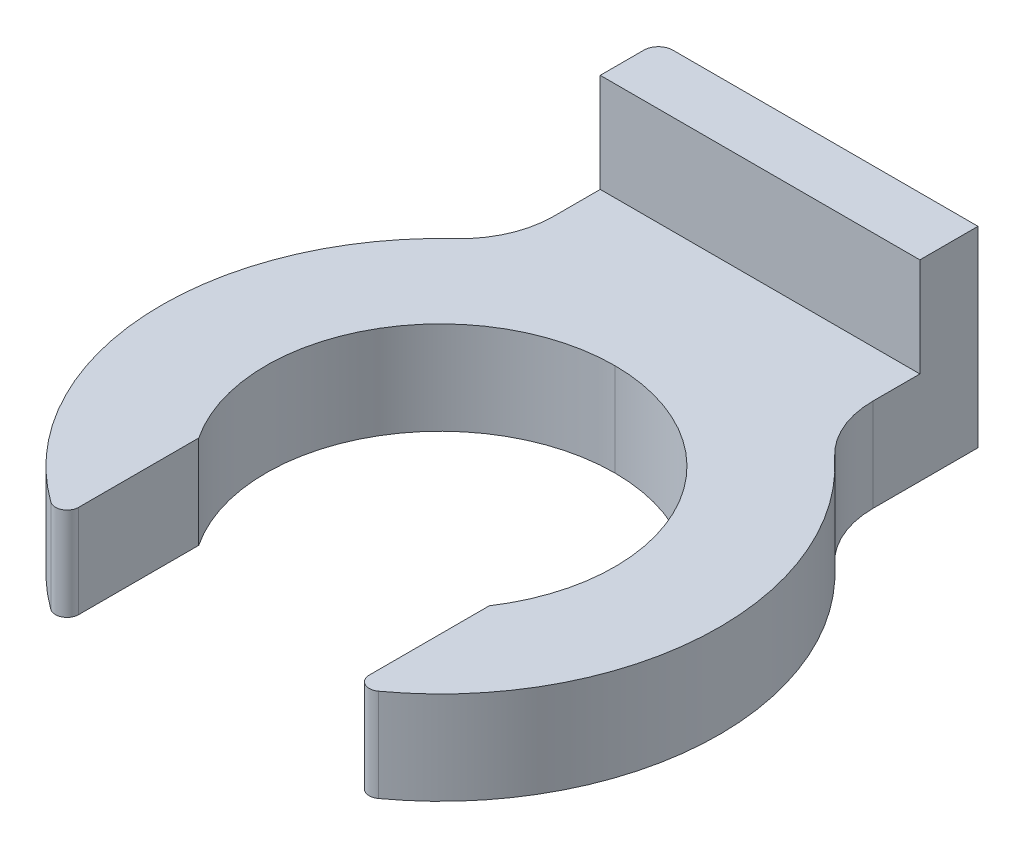
ISO-10303-21;
HEADER;
FILE_DESCRIPTION(('STEP AP214'),'2;1');
FILE_NAME('part.step','',(''),(''),'','','');
FILE_SCHEMA(('AUTOMOTIVE_DESIGN { 1 0 10303 214 1 1 1 1 }'));
ENDSEC;
DATA;
#1=APPLICATION_CONTEXT('core data for automotive mechanical design processes');
#2=APPLICATION_PROTOCOL_DEFINITION('international standard','automotive_design',2000,#1);
#3=PRODUCT_CONTEXT('',#1,'mechanical');
#4=PRODUCT('Part','Part','',(#3));
#5=PRODUCT_RELATED_PRODUCT_CATEGORY('part','',(#4));
#6=PRODUCT_DEFINITION_FORMATION('','',#4);
#7=PRODUCT_DEFINITION_CONTEXT('part definition',#1,'design');
#8=PRODUCT_DEFINITION('design','',#6,#7);
#9=PRODUCT_DEFINITION_SHAPE('','',#8);
#10=(LENGTH_UNIT() NAMED_UNIT(*) SI_UNIT(.MILLI.,.METRE.));
#11=(NAMED_UNIT(*) PLANE_ANGLE_UNIT() SI_UNIT($,.RADIAN.));
#12=(NAMED_UNIT(*) SI_UNIT($,.STERADIAN.) SOLID_ANGLE_UNIT());
#13=UNCERTAINTY_MEASURE_WITH_UNIT(LENGTH_MEASURE(1.E-05),#10,'distance_accuracy_value','');
#14=(GEOMETRIC_REPRESENTATION_CONTEXT(3) GLOBAL_UNCERTAINTY_ASSIGNED_CONTEXT((#13)) GLOBAL_UNIT_ASSIGNED_CONTEXT((#10,
#11,#12)) REPRESENTATION_CONTEXT('',''));
#15=CARTESIAN_POINT('',(0.,0.,0.));
#16=DIRECTION('',(0.,0.,1.));
#17=DIRECTION('',(1.,0.,0.));
#18=AXIS2_PLACEMENT_3D('',#15,#16,#17);
#19=CARTESIAN_POINT('',(-2.5,1.6,-6.25));
#20=DIRECTION('',(0.,-1.,0.));
#21=DIRECTION('',(0.,0.,-1.));
#22=AXIS2_PLACEMENT_3D('',#19,#20,#21);
#23=CYLINDRICAL_SURFACE('',#22,0.25);
#24=CARTESIAN_POINT('',(-2.5,3.3,-6.25));
#25=DIRECTION('',(0.,1.,0.));
#26=DIRECTION('',(0.,0.,1.));
#27=AXIS2_PLACEMENT_3D('',#24,#25,#26);
#28=CIRCLE('',#27,0.25);
#29=CARTESIAN_POINT('',(-2.5,3.3,-6.5));
#30=VERTEX_POINT('',#29);
#31=CARTESIAN_POINT('',(-2.75,3.3,-6.25));
#32=VERTEX_POINT('',#31);
#33=EDGE_CURVE('E11',#30,#32,#28,.T.);
#34=ORIENTED_EDGE('',*,*,#33,.F.);
#35=DIRECTION('',(0.,1.,0.));
#36=VECTOR('',#35,1.);
#37=CARTESIAN_POINT('',(-2.5,1.6,-6.5));
#38=LINE('',#37,#36);
#39=CARTESIAN_POINT('',(-2.5,0.,-6.5));
#40=VERTEX_POINT('',#39);
#41=EDGE_CURVE('E232',#40,#30,#38,.T.);
#42=ORIENTED_EDGE('',*,*,#41,.F.);
#43=CARTESIAN_POINT('',(-2.5,0.,-6.25));
#44=DIRECTION('',(0.,-1.,0.));
#45=DIRECTION('',(0.,0.,1.));
#46=AXIS2_PLACEMENT_3D('',#43,#44,#45);
#47=CIRCLE('',#46,0.25);
#48=CARTESIAN_POINT('',(-2.75,0.,-6.25));
#49=VERTEX_POINT('',#48);
#50=EDGE_CURVE('E207',#49,#40,#47,.T.);
#51=ORIENTED_EDGE('',*,*,#50,.F.);
#52=DIRECTION('',(0.,-1.,0.));
#53=VECTOR('',#52,1.);
#54=CARTESIAN_POINT('',(-2.75,1.6,-6.25));
#55=LINE('',#54,#53);
#56=EDGE_CURVE('E188',#32,#49,#55,.T.);
#57=ORIENTED_EDGE('',*,*,#56,.F.);
#58=EDGE_LOOP('',(#34,#42,#51,#57));
#59=FACE_BOUND('',#58,.T.);
#60=ADVANCED_FACE('F16',(#59),#23,.T.);
#61=CARTESIAN_POINT('',(-4.35,1.6,-4.69441157121955));
#62=DIRECTION('',(0.,-1.,0.));
#63=DIRECTION('',(0.,0.,-1.));
#64=AXIS2_PLACEMENT_3D('',#61,#62,#63);
#65=CYLINDRICAL_SURFACE('',#64,1.6);
#66=CARTESIAN_POINT('',(-4.35,1.6,-4.69441157121955));
#67=DIRECTION('',(0.,-1.,0.));
#68=DIRECTION('',(0.,0.,1.));
#69=AXIS2_PLACEMENT_3D('',#66,#67,#68);
#70=CIRCLE('',#69,1.6);
#71=CARTESIAN_POINT('',(-2.75,1.6,-4.69441157121955));
#72=VERTEX_POINT('',#71);
#73=CARTESIAN_POINT('',(-3.2625,1.6,-3.52080867841467));
#74=VERTEX_POINT('',#73);
#75=EDGE_CURVE('E204',#72,#74,#70,.T.);
#76=ORIENTED_EDGE('',*,*,#75,.F.);
#77=DIRECTION('',(0.,1.,0.));
#78=VECTOR('',#77,1.);
#79=CARTESIAN_POINT('',(-2.75,1.6,-4.69441157121955));
#80=LINE('',#79,#78);
#81=CARTESIAN_POINT('',(-2.75,0.,-4.69441157121955));
#82=VERTEX_POINT('',#81);
#83=EDGE_CURVE('E137',#82,#72,#80,.T.);
#84=ORIENTED_EDGE('',*,*,#83,.F.);
#85=CARTESIAN_POINT('',(-4.35,0.,-4.69441157121955));
#86=DIRECTION('',(0.,1.,0.));
#87=DIRECTION('',(0.,0.,1.));
#88=AXIS2_PLACEMENT_3D('',#85,#86,#87);
#89=CIRCLE('',#88,1.6);
#90=CARTESIAN_POINT('',(-3.2625,0.,-3.52080867841467));
#91=VERTEX_POINT('',#90);
#92=EDGE_CURVE('E130',#91,#82,#89,.T.);
#93=ORIENTED_EDGE('',*,*,#92,.F.);
#94=DIRECTION('',(0.,-1.,0.));
#95=VECTOR('',#94,1.);
#96=CARTESIAN_POINT('',(-3.2625,1.6,-3.52080867841467));
#97=LINE('',#96,#95);
#98=EDGE_CURVE('E134',#74,#91,#97,.T.);
#99=ORIENTED_EDGE('',*,*,#98,.F.);
#100=EDGE_LOOP('',(#76,#84,#93,#99));
#101=FACE_BOUND('',#100,.T.);
#102=ADVANCED_FACE('F132',(#101),#65,.F.);
#103=CARTESIAN_POINT('',(4.35,1.6,-4.69441157121955));
#104=DIRECTION('',(0.,-1.,0.));
#105=DIRECTION('',(0.,0.,-1.));
#106=AXIS2_PLACEMENT_3D('',#103,#104,#105);
#107=CYLINDRICAL_SURFACE('',#106,1.6);
#108=CARTESIAN_POINT('',(4.35,1.6,-4.69441157121955));
#109=DIRECTION('',(0.,-1.,0.));
#110=DIRECTION('',(0.,0.,1.));
#111=AXIS2_PLACEMENT_3D('',#108,#109,#110);
#112=CIRCLE('',#111,1.6);
#113=CARTESIAN_POINT('',(3.2625,1.6,-3.52080867841467));
#114=VERTEX_POINT('',#113);
#115=CARTESIAN_POINT('',(2.75,1.6,-4.69441157121955));
#116=VERTEX_POINT('',#115);
#117=EDGE_CURVE('E208',#114,#116,#112,.T.);
#118=ORIENTED_EDGE('',*,*,#117,.F.);
#119=DIRECTION('',(0.,1.,0.));
#120=VECTOR('',#119,1.);
#121=CARTESIAN_POINT('',(3.2625,1.6,-3.52080867841467));
#122=LINE('',#121,#120);
#123=CARTESIAN_POINT('',(3.2625,0.,-3.52080867841467));
#124=VERTEX_POINT('',#123);
#125=EDGE_CURVE('E258',#124,#114,#122,.T.);
#126=ORIENTED_EDGE('',*,*,#125,.F.);
#127=CARTESIAN_POINT('',(4.35,0.,-4.69441157121955));
#128=DIRECTION('',(0.,1.,0.));
#129=DIRECTION('',(0.,0.,1.));
#130=AXIS2_PLACEMENT_3D('',#127,#128,#129);
#131=CIRCLE('',#130,1.6);
#132=CARTESIAN_POINT('',(2.75,0.,-4.69441157121955));
#133=VERTEX_POINT('',#132);
#134=EDGE_CURVE('E296',#133,#124,#131,.T.);
#135=ORIENTED_EDGE('',*,*,#134,.F.);
#136=DIRECTION('',(0.,-1.,0.));
#137=VECTOR('',#136,1.);
#138=CARTESIAN_POINT('',(2.75,0.,-4.69441157121955));
#139=LINE('',#138,#137);
#140=EDGE_CURVE('E244',#116,#133,#139,.T.);
#141=ORIENTED_EDGE('',*,*,#140,.F.);
#142=EDGE_LOOP('',(#118,#126,#135,#141));
#143=FACE_BOUND('',#142,.T.);
#144=ADVANCED_FACE('F490',(#143),#107,.F.);
#145=CARTESIAN_POINT('',(2.7,1.6,3.72424488990722));
#146=DIRECTION('',(0.,-1.,0.));
#147=DIRECTION('',(0.,0.,-1.));
#148=AXIS2_PLACEMENT_3D('',#145,#146,#147);
#149=CYLINDRICAL_SURFACE('',#148,0.2);
#150=CARTESIAN_POINT('',(2.7,1.6,3.72424488990722));
#151=DIRECTION('',(0.,1.,0.));
#152=DIRECTION('',(0.,0.,1.));
#153=AXIS2_PLACEMENT_3D('',#150,#151,#152);
#154=CIRCLE('',#153,0.2);
#155=CARTESIAN_POINT('',(2.5,1.6,3.72424488990722));
#156=VERTEX_POINT('',#155);
#157=CARTESIAN_POINT('',(2.81739130434782,1.6,3.88616858077275));
#158=VERTEX_POINT('',#157);
#159=EDGE_CURVE('E215',#156,#158,#154,.T.);
#160=ORIENTED_EDGE('',*,*,#159,.F.);
#161=DIRECTION('',(0.,1.,0.));
#162=VECTOR('',#161,1.);
#163=CARTESIAN_POINT('',(2.5,1.6,3.72424488990722));
#164=LINE('',#163,#162);
#165=CARTESIAN_POINT('',(2.5,0.,3.72424488990722));
#166=VERTEX_POINT('',#165);
#167=EDGE_CURVE('E199',#166,#156,#164,.T.);
#168=ORIENTED_EDGE('',*,*,#167,.F.);
#169=CARTESIAN_POINT('',(2.7,0.,3.72424488990722));
#170=DIRECTION('',(0.,-1.,0.));
#171=DIRECTION('',(0.,0.,1.));
#172=AXIS2_PLACEMENT_3D('',#169,#170,#171);
#173=CIRCLE('',#172,0.2);
#174=CARTESIAN_POINT('',(2.81739130434782,0.,3.88616858077275));
#175=VERTEX_POINT('',#174);
#176=EDGE_CURVE('E181',#175,#166,#173,.T.);
#177=ORIENTED_EDGE('',*,*,#176,.F.);
#178=DIRECTION('',(0.,-1.,0.));
#179=VECTOR('',#178,1.);
#180=CARTESIAN_POINT('',(2.81739130434783,1.6,3.88616858077275));
#181=LINE('',#180,#179);
#182=EDGE_CURVE('E245',#158,#175,#181,.T.);
#183=ORIENTED_EDGE('',*,*,#182,.F.);
#184=EDGE_LOOP('',(#160,#168,#177,#183));
#185=FACE_BOUND('',#184,.T.);
#186=ADVANCED_FACE('F325',(#185),#149,.T.);
#187=CARTESIAN_POINT('',(-2.7,1.6,3.72424488990722));
#188=DIRECTION('',(0.,-1.,0.));
#189=DIRECTION('',(0.,0.,-1.));
#190=AXIS2_PLACEMENT_3D('',#187,#188,#189);
#191=CYLINDRICAL_SURFACE('',#190,0.2);
#192=CARTESIAN_POINT('',(-2.7,1.6,3.72424488990722));
#193=DIRECTION('',(0.,1.,0.));
#194=DIRECTION('',(0.,0.,1.));
#195=AXIS2_PLACEMENT_3D('',#192,#193,#194);
#196=CIRCLE('',#195,0.2);
#197=CARTESIAN_POINT('',(-2.81739130434782,1.6,3.88616858077275));
#198=VERTEX_POINT('',#197);
#199=CARTESIAN_POINT('',(-2.5,1.6,3.72424488990722));
#200=VERTEX_POINT('',#199);
#201=EDGE_CURVE('E213',#198,#200,#196,.T.);
#202=ORIENTED_EDGE('',*,*,#201,.F.);
#203=DIRECTION('',(0.,1.,0.));
#204=VECTOR('',#203,1.);
#205=CARTESIAN_POINT('',(-2.81739130434782,1.6,3.88616858077275));
#206=LINE('',#205,#204);
#207=CARTESIAN_POINT('',(-2.81739130434782,0.,3.88616858077275));
#208=VERTEX_POINT('',#207);
#209=EDGE_CURVE('E153',#208,#198,#206,.T.);
#210=ORIENTED_EDGE('',*,*,#209,.F.);
#211=CARTESIAN_POINT('',(-2.7,0.,3.72424488990722));
#212=DIRECTION('',(0.,-1.,0.));
#213=DIRECTION('',(0.,0.,1.));
#214=AXIS2_PLACEMENT_3D('',#211,#212,#213);
#215=CIRCLE('',#214,0.2);
#216=CARTESIAN_POINT('',(-2.5,0.,3.72424488990722));
#217=VERTEX_POINT('',#216);
#218=EDGE_CURVE('E142',#217,#208,#215,.T.);
#219=ORIENTED_EDGE('',*,*,#218,.F.);
#220=DIRECTION('',(0.,-1.,0.));
#221=VECTOR('',#220,1.);
#222=CARTESIAN_POINT('',(-2.5,1.6,3.72424488990722));
#223=LINE('',#222,#221);
#224=EDGE_CURVE('E182',#200,#217,#223,.T.);
#225=ORIENTED_EDGE('',*,*,#224,.F.);
#226=EDGE_LOOP('',(#202,#210,#219,#225));
#227=FACE_BOUND('',#226,.T.);
#228=ADVANCED_FACE('F18',(#227),#191,.T.);
#229=CARTESIAN_POINT('',(0.,3.3,0.));
#230=DIRECTION('',(0.,1.,0.));
#231=DIRECTION('',(1.,0.,0.));
#232=AXIS2_PLACEMENT_3D('',#229,#230,#231);
#233=PLANE('',#232);
#234=DIRECTION('',(-1.,0.,0.));
#235=VECTOR('',#234,1.);
#236=CARTESIAN_POINT('',(-2.75,3.3,-6.5));
#237=LINE('',#236,#235);
#238=CARTESIAN_POINT('',(2.75,3.3,-6.5));
#239=VERTEX_POINT('',#238);
#240=EDGE_CURVE('E236',#239,#30,#237,.T.);
#241=ORIENTED_EDGE('',*,*,#240,.T.);
#242=ORIENTED_EDGE('',*,*,#33,.T.);
#243=DIRECTION('',(0.,0.,1.));
#244=VECTOR('',#243,1.);
#245=CARTESIAN_POINT('',(-2.75,3.3,-6.5));
#246=LINE('',#245,#244);
#247=CARTESIAN_POINT('',(-2.75,3.3,-5.5));
#248=VERTEX_POINT('',#247);
#249=EDGE_CURVE('E193',#32,#248,#246,.T.);
#250=ORIENTED_EDGE('',*,*,#249,.T.);
#251=DIRECTION('',(1.,0.,0.));
#252=VECTOR('',#251,1.);
#253=CARTESIAN_POINT('',(-2.75,3.3,-5.5));
#254=LINE('',#253,#252);
#255=CARTESIAN_POINT('',(2.75,3.3,-5.5));
#256=VERTEX_POINT('',#255);
#257=EDGE_CURVE('E27',#248,#256,#254,.T.);
#258=ORIENTED_EDGE('',*,*,#257,.T.);
#259=DIRECTION('',(0.,0.,-1.));
#260=VECTOR('',#259,1.);
#261=CARTESIAN_POINT('',(2.75,3.3,-6.5));
#262=LINE('',#261,#260);
#263=EDGE_CURVE('E212',#256,#239,#262,.T.);
#264=ORIENTED_EDGE('',*,*,#263,.T.);
#265=EDGE_LOOP('',(#241,#242,#250,#258,#264));
#266=FACE_BOUND('',#265,.T.);
#267=ADVANCED_FACE('F563',(#266),#233,.T.);
#268=CARTESIAN_POINT('',(-2.75,12.1901699437495,-5.5));
#269=DIRECTION('',(0.,0.,-1.));
#270=DIRECTION('',(0.,-1.,0.));
#271=AXIS2_PLACEMENT_3D('',#268,#269,#270);
#272=PLANE('',#271);
#273=ORIENTED_EDGE('',*,*,#257,.F.);
#274=DIRECTION('',(0.,-1.,0.));
#275=VECTOR('',#274,1.);
#276=CARTESIAN_POINT('',(-2.75,12.1901699437495,-5.5));
#277=LINE('',#276,#275);
#278=CARTESIAN_POINT('',(-2.75,1.6,-5.5));
#279=VERTEX_POINT('',#278);
#280=EDGE_CURVE('E173',#248,#279,#277,.T.);
#281=ORIENTED_EDGE('',*,*,#280,.T.);
#282=DIRECTION('',(1.,0.,0.));
#283=VECTOR('',#282,1.);
#284=CARTESIAN_POINT('',(-2.75,1.6,-5.5));
#285=LINE('',#284,#283);
#286=CARTESIAN_POINT('',(2.75,1.6,-5.5));
#287=VERTEX_POINT('',#286);
#288=EDGE_CURVE('E42',#279,#287,#285,.T.);
#289=ORIENTED_EDGE('',*,*,#288,.T.);
#290=DIRECTION('',(0.,-1.,0.));
#291=VECTOR('',#290,1.);
#292=CARTESIAN_POINT('',(2.75,12.1901699437495,-5.5));
#293=LINE('',#292,#291);
#294=EDGE_CURVE('E209',#256,#287,#293,.T.);
#295=ORIENTED_EDGE('',*,*,#294,.F.);
#296=EDGE_LOOP('',(#273,#281,#289,#295));
#297=FACE_BOUND('',#296,.T.);
#298=ADVANCED_FACE('F517',(#297),#272,.F.);
#299=CARTESIAN_POINT('',(0.,0.,0.));
#300=DIRECTION('',(0.,1.,0.));
#301=DIRECTION('',(1.,0.,0.));
#302=AXIS2_PLACEMENT_3D('',#299,#300,#301);
#303=PLANE('',#302);
#304=DIRECTION('',(0.,0.,1.));
#305=VECTOR('',#304,1.);
#306=CARTESIAN_POINT('',(-2.75,0.,-3.93414539639805));
#307=LINE('',#306,#305);
#308=EDGE_CURVE('E192',#49,#82,#307,.T.);
#309=ORIENTED_EDGE('',*,*,#308,.F.);
#310=ORIENTED_EDGE('',*,*,#50,.T.);
#311=DIRECTION('',(-1.,0.,0.));
#312=VECTOR('',#311,1.);
#313=CARTESIAN_POINT('',(-2.75,0.,-6.5));
#314=LINE('',#313,#312);
#315=CARTESIAN_POINT('',(2.75,0.,-6.5));
#316=VERTEX_POINT('',#315);
#317=EDGE_CURVE('E169',#316,#40,#314,.T.);
#318=ORIENTED_EDGE('',*,*,#317,.F.);
#319=DIRECTION('',(0.,0.,-1.));
#320=VECTOR('',#319,1.);
#321=CARTESIAN_POINT('',(2.75,0.,-3.93414539639805));
#322=LINE('',#321,#320);
#323=EDGE_CURVE('E20',#133,#316,#322,.T.);
#324=ORIENTED_EDGE('',*,*,#323,.F.);
#325=ORIENTED_EDGE('',*,*,#134,.T.);
#326=CARTESIAN_POINT('',(0.,0.,0.));
#327=DIRECTION('',(0.,1.,0.));
#328=DIRECTION('',(0.,0.,1.));
#329=AXIS2_PLACEMENT_3D('',#326,#327,#328);
#330=CIRCLE('',#329,4.8);
#331=EDGE_CURVE('E198',#175,#124,#330,.T.);
#332=ORIENTED_EDGE('',*,*,#331,.F.);
#333=ORIENTED_EDGE('',*,*,#176,.T.);
#334=DIRECTION('',(0.,0.,1.));
#335=VECTOR('',#334,1.);
#336=CARTESIAN_POINT('',(2.5,0.,1.6583123951777));
#337=LINE('',#336,#335);
#338=CARTESIAN_POINT('',(2.5,0.,1.6583123951777));
#339=VERTEX_POINT('',#338);
#340=EDGE_CURVE('E280',#339,#166,#337,.T.);
#341=ORIENTED_EDGE('',*,*,#340,.F.);
#342=CARTESIAN_POINT('',(0.,0.,0.));
#343=DIRECTION('',(0.,-1.,0.));
#344=DIRECTION('',(0.,0.,1.));
#345=AXIS2_PLACEMENT_3D('',#342,#343,#344);
#346=CIRCLE('',#345,3.);
#347=CARTESIAN_POINT('',(0.,0.,-3.));
#348=VERTEX_POINT('',#347);
#349=EDGE_CURVE('E279',#348,#339,#346,.T.);
#350=ORIENTED_EDGE('',*,*,#349,.F.);
#351=CARTESIAN_POINT('',(0.,0.,0.));
#352=DIRECTION('',(0.,-1.,0.));
#353=DIRECTION('',(0.,0.,1.));
#354=AXIS2_PLACEMENT_3D('',#351,#352,#353);
#355=CIRCLE('',#354,3.);
#356=CARTESIAN_POINT('',(-2.5,0.,1.6583123951777));
#357=VERTEX_POINT('',#356);
#358=EDGE_CURVE('E177',#357,#348,#355,.T.);
#359=ORIENTED_EDGE('',*,*,#358,.F.);
#360=DIRECTION('',(0.,0.,-1.));
#361=VECTOR('',#360,1.);
#362=CARTESIAN_POINT('',(-2.5,0.,1.6583123951777));
#363=LINE('',#362,#361);
#364=EDGE_CURVE('E186',#217,#357,#363,.T.);
#365=ORIENTED_EDGE('',*,*,#364,.F.);
#366=ORIENTED_EDGE('',*,*,#218,.T.);
#367=CARTESIAN_POINT('',(0.,0.,0.));
#368=DIRECTION('',(0.,1.,0.));
#369=DIRECTION('',(0.,0.,1.));
#370=AXIS2_PLACEMENT_3D('',#367,#368,#369);
#371=CIRCLE('',#370,4.8);
#372=EDGE_CURVE('E145',#91,#208,#371,.T.);
#373=ORIENTED_EDGE('',*,*,#372,.F.);
#374=ORIENTED_EDGE('',*,*,#92,.T.);
#375=EDGE_LOOP('',(#309,#310,#318,#324,#325,#332,#333,#341,#350,#359,#365,#366,#373,#374));
#376=FACE_BOUND('',#375,.T.);
#377=ADVANCED_FACE('F146',(#376),#303,.F.);
#378=CARTESIAN_POINT('',(0.,1.6,0.));
#379=DIRECTION('',(0.,1.,0.));
#380=DIRECTION('',(1.,0.,0.));
#381=AXIS2_PLACEMENT_3D('',#378,#379,#380);
#382=PLANE('',#381);
#383=DIRECTION('',(0.,0.,1.));
#384=VECTOR('',#383,1.);
#385=CARTESIAN_POINT('',(-2.75,1.6,-3.93414539639805));
#386=LINE('',#385,#384);
#387=EDGE_CURVE('E171',#279,#72,#386,.T.);
#388=ORIENTED_EDGE('',*,*,#387,.T.);
#389=ORIENTED_EDGE('',*,*,#75,.T.);
#390=CARTESIAN_POINT('',(0.,1.6,0.));
#391=DIRECTION('',(0.,1.,0.));
#392=DIRECTION('',(0.,0.,1.));
#393=AXIS2_PLACEMENT_3D('',#390,#391,#392);
#394=CIRCLE('',#393,4.8);
#395=EDGE_CURVE('E157',#74,#198,#394,.T.);
#396=ORIENTED_EDGE('',*,*,#395,.T.);
#397=ORIENTED_EDGE('',*,*,#201,.T.);
#398=DIRECTION('',(0.,0.,-1.));
#399=VECTOR('',#398,1.);
#400=CARTESIAN_POINT('',(-2.5,1.6,1.6583123951777));
#401=LINE('',#400,#399);
#402=CARTESIAN_POINT('',(-2.5,1.6,1.6583123951777));
#403=VERTEX_POINT('',#402);
#404=EDGE_CURVE('E187',#200,#403,#401,.T.);
#405=ORIENTED_EDGE('',*,*,#404,.T.);
#406=CARTESIAN_POINT('',(0.,1.6,0.));
#407=DIRECTION('',(0.,-1.,0.));
#408=DIRECTION('',(0.,0.,1.));
#409=AXIS2_PLACEMENT_3D('',#406,#407,#408);
#410=CIRCLE('',#409,3.);
#411=CARTESIAN_POINT('',(0.,1.6,-3.));
#412=VERTEX_POINT('',#411);
#413=EDGE_CURVE('E174',#403,#412,#410,.T.);
#414=ORIENTED_EDGE('',*,*,#413,.T.);
#415=CARTESIAN_POINT('',(0.,1.6,0.));
#416=DIRECTION('',(0.,-1.,0.));
#417=DIRECTION('',(0.,0.,1.));
#418=AXIS2_PLACEMENT_3D('',#415,#416,#417);
#419=CIRCLE('',#418,3.);
#420=CARTESIAN_POINT('',(2.5,1.6,1.6583123951777));
#421=VERTEX_POINT('',#420);
#422=EDGE_CURVE('E270',#412,#421,#419,.T.);
#423=ORIENTED_EDGE('',*,*,#422,.T.);
#424=DIRECTION('',(0.,0.,1.));
#425=VECTOR('',#424,1.);
#426=CARTESIAN_POINT('',(2.5,1.6,1.6583123951777));
#427=LINE('',#426,#425);
#428=EDGE_CURVE('E194',#421,#156,#427,.T.);
#429=ORIENTED_EDGE('',*,*,#428,.T.);
#430=ORIENTED_EDGE('',*,*,#159,.T.);
#431=CARTESIAN_POINT('',(0.,1.6,0.));
#432=DIRECTION('',(0.,1.,0.));
#433=DIRECTION('',(0.,0.,1.));
#434=AXIS2_PLACEMENT_3D('',#431,#432,#433);
#435=CIRCLE('',#434,4.8);
#436=EDGE_CURVE('E248',#158,#114,#435,.T.);
#437=ORIENTED_EDGE('',*,*,#436,.T.);
#438=ORIENTED_EDGE('',*,*,#117,.T.);
#439=DIRECTION('',(0.,0.,-1.));
#440=VECTOR('',#439,1.);
#441=CARTESIAN_POINT('',(2.75,1.6,-3.93414539639805));
#442=LINE('',#441,#440);
#443=EDGE_CURVE('E242',#116,#287,#442,.T.);
#444=ORIENTED_EDGE('',*,*,#443,.T.);
#445=ORIENTED_EDGE('',*,*,#288,.F.);
#446=EDGE_LOOP('',(#388,#389,#396,#397,#405,#414,#423,#429,#430,#437,#438,#444,#445));
#447=FACE_BOUND('',#446,.T.);
#448=ADVANCED_FACE('F516',(#447),#382,.T.);
#449=CARTESIAN_POINT('',(-2.75,1.6,-3.93414539639805));
#450=DIRECTION('',(1.,0.,0.));
#451=DIRECTION('',(0.,0.,-1.));
#452=AXIS2_PLACEMENT_3D('',#449,#450,#451);
#453=PLANE('',#452);
#454=ORIENTED_EDGE('',*,*,#249,.F.);
#455=ORIENTED_EDGE('',*,*,#56,.T.);
#456=ORIENTED_EDGE('',*,*,#308,.T.);
#457=ORIENTED_EDGE('',*,*,#83,.T.);
#458=ORIENTED_EDGE('',*,*,#387,.F.);
#459=ORIENTED_EDGE('',*,*,#280,.F.);
#460=EDGE_LOOP('',(#454,#455,#456,#457,#458,#459));
#461=FACE_BOUND('',#460,.T.);
#462=ADVANCED_FACE('F522',(#461),#453,.F.);
#463=CARTESIAN_POINT('',(-2.75,1.6,-6.5));
#464=DIRECTION('',(0.,0.,1.));
#465=DIRECTION('',(1.,0.,0.));
#466=AXIS2_PLACEMENT_3D('',#463,#464,#465);
#467=PLANE('',#466);
#468=ORIENTED_EDGE('',*,*,#317,.T.);
#469=ORIENTED_EDGE('',*,*,#41,.T.);
#470=ORIENTED_EDGE('',*,*,#240,.F.);
#471=DIRECTION('',(0.,-1.,0.));
#472=VECTOR('',#471,1.);
#473=CARTESIAN_POINT('',(2.75,1.6,-6.5));
#474=LINE('',#473,#472);
#475=EDGE_CURVE('E287',#239,#316,#474,.T.);
#476=ORIENTED_EDGE('',*,*,#475,.T.);
#477=EDGE_LOOP('',(#468,#469,#470,#476));
#478=FACE_BOUND('',#477,.T.);
#479=ADVANCED_FACE('F500',(#478),#467,.F.);
#480=CARTESIAN_POINT('',(2.75,1.6,-3.93414539639805));
#481=DIRECTION('',(-1.,0.,0.));
#482=DIRECTION('',(0.,0.,1.));
#483=AXIS2_PLACEMENT_3D('',#480,#481,#482);
#484=PLANE('',#483);
#485=ORIENTED_EDGE('',*,*,#443,.F.);
#486=ORIENTED_EDGE('',*,*,#140,.T.);
#487=ORIENTED_EDGE('',*,*,#323,.T.);
#488=ORIENTED_EDGE('',*,*,#475,.F.);
#489=ORIENTED_EDGE('',*,*,#263,.F.);
#490=ORIENTED_EDGE('',*,*,#294,.T.);
#491=EDGE_LOOP('',(#485,#486,#487,#488,#489,#490));
#492=FACE_BOUND('',#491,.T.);
#493=ADVANCED_FACE('F495',(#492),#484,.F.);
#494=CARTESIAN_POINT('',(0.,1.6,0.));
#495=DIRECTION('',(0.,-1.,0.));
#496=DIRECTION('',(0.,0.,-1.));
#497=AXIS2_PLACEMENT_3D('',#494,#495,#496);
#498=CYLINDRICAL_SURFACE('',#497,4.8);
#499=ORIENTED_EDGE('',*,*,#331,.T.);
#500=ORIENTED_EDGE('',*,*,#125,.T.);
#501=ORIENTED_EDGE('',*,*,#436,.F.);
#502=ORIENTED_EDGE('',*,*,#182,.T.);
#503=EDGE_LOOP('',(#499,#500,#501,#502));
#504=FACE_BOUND('',#503,.T.);
#505=ADVANCED_FACE('F499',(#504),#498,.T.);
#506=CARTESIAN_POINT('',(2.5,1.6,1.6583123951777));
#507=DIRECTION('',(1.,0.,0.));
#508=DIRECTION('',(0.,0.,-1.));
#509=AXIS2_PLACEMENT_3D('',#506,#507,#508);
#510=PLANE('',#509);
#511=ORIENTED_EDGE('',*,*,#340,.T.);
#512=ORIENTED_EDGE('',*,*,#167,.T.);
#513=ORIENTED_EDGE('',*,*,#428,.F.);
#514=DIRECTION('',(0.,-1.,0.));
#515=VECTOR('',#514,1.);
#516=CARTESIAN_POINT('',(2.5,1.6,1.6583123951777));
#517=LINE('',#516,#515);
#518=EDGE_CURVE('E165',#421,#339,#517,.T.);
#519=ORIENTED_EDGE('',*,*,#518,.T.);
#520=EDGE_LOOP('',(#511,#512,#513,#519));
#521=FACE_BOUND('',#520,.T.);
#522=ADVANCED_FACE('F328',(#521),#510,.F.);
#523=CARTESIAN_POINT('',(0.,1.6,0.));
#524=DIRECTION('',(0.,-1.,0.));
#525=DIRECTION('',(0.,0.,-1.));
#526=AXIS2_PLACEMENT_3D('',#523,#524,#525);
#527=CYLINDRICAL_SURFACE('',#526,3.);
#528=DIRECTION('',(0.,-1.,0.));
#529=VECTOR('',#528,1.);
#530=CARTESIAN_POINT('',(0.,1.6,-3.));
#531=LINE('',#530,#529);
#532=EDGE_CURVE('E273',#412,#348,#531,.T.);
#533=ORIENTED_EDGE('',*,*,#532,.F.);
#534=ORIENTED_EDGE('',*,*,#413,.F.);
#535=DIRECTION('',(0.,-1.,0.));
#536=VECTOR('',#535,1.);
#537=CARTESIAN_POINT('',(-2.5,1.6,1.6583123951777));
#538=LINE('',#537,#536);
#539=EDGE_CURVE('E178',#403,#357,#538,.T.);
#540=ORIENTED_EDGE('',*,*,#539,.T.);
#541=ORIENTED_EDGE('',*,*,#358,.T.);
#542=EDGE_LOOP('',(#533,#534,#540,#541));
#543=FACE_BOUND('',#542,.T.);
#544=ADVANCED_FACE('F343',(#543),#527,.F.);
#545=CARTESIAN_POINT('',(-2.5,1.6,1.6583123951777));
#546=DIRECTION('',(-1.,0.,0.));
#547=DIRECTION('',(0.,1.,0.));
#548=AXIS2_PLACEMENT_3D('',#545,#546,#547);
#549=PLANE('',#548);
#550=ORIENTED_EDGE('',*,*,#404,.F.);
#551=ORIENTED_EDGE('',*,*,#224,.T.);
#552=ORIENTED_EDGE('',*,*,#364,.T.);
#553=ORIENTED_EDGE('',*,*,#539,.F.);
#554=EDGE_LOOP('',(#550,#551,#552,#553));
#555=FACE_BOUND('',#554,.T.);
#556=ADVANCED_FACE('F346',(#555),#549,.F.);
#557=CARTESIAN_POINT('',(0.,1.6,0.));
#558=DIRECTION('',(0.,-1.,0.));
#559=DIRECTION('',(0.,0.,-1.));
#560=AXIS2_PLACEMENT_3D('',#557,#558,#559);
#561=CYLINDRICAL_SURFACE('',#560,4.8);
#562=ORIENTED_EDGE('',*,*,#395,.F.);
#563=ORIENTED_EDGE('',*,*,#98,.T.);
#564=ORIENTED_EDGE('',*,*,#372,.T.);
#565=ORIENTED_EDGE('',*,*,#209,.T.);
#566=EDGE_LOOP('',(#562,#563,#564,#565));
#567=FACE_BOUND('',#566,.T.);
#568=ADVANCED_FACE('F155',(#567),#561,.T.);
#569=CARTESIAN_POINT('',(0.,1.6,0.));
#570=DIRECTION('',(0.,-1.,0.));
#571=DIRECTION('',(0.,0.,-1.));
#572=AXIS2_PLACEMENT_3D('',#569,#570,#571);
#573=CYLINDRICAL_SURFACE('',#572,3.);
#574=ORIENTED_EDGE('',*,*,#422,.F.);
#575=ORIENTED_EDGE('',*,*,#532,.T.);
#576=ORIENTED_EDGE('',*,*,#349,.T.);
#577=ORIENTED_EDGE('',*,*,#518,.F.);
#578=EDGE_LOOP('',(#574,#575,#576,#577));
#579=FACE_BOUND('',#578,.T.);
#580=ADVANCED_FACE('F333',(#579),#573,.F.);
#581=CLOSED_SHELL('',(#60,#102,#144,#186,#228,#267,#298,#377,#448,#462,#479,#493,#505,#522,#544,
#556,#568,#580));
#582=MANIFOLD_SOLID_BREP('B1',#581);
#583=ADVANCED_BREP_SHAPE_REPRESENTATION('',(#18,#582),#14);
#584=SHAPE_DEFINITION_REPRESENTATION(#9,#583);
ENDSEC;
END-ISO-10303-21;
